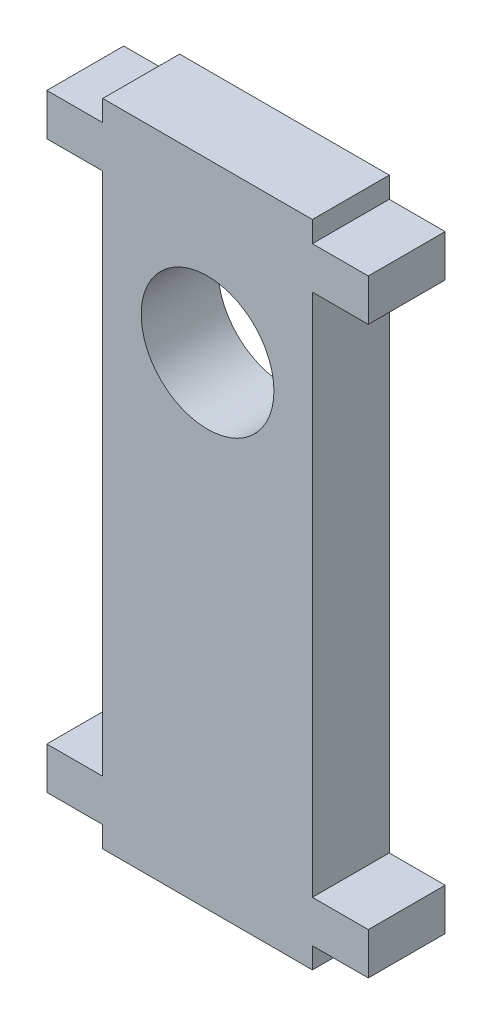
ISO-10303-21;
HEADER;
FILE_DESCRIPTION(('STEP AP214'),'2;1');
FILE_NAME('part.step','',(''),(''),'','','');
FILE_SCHEMA(('AUTOMOTIVE_DESIGN { 1 0 10303 214 1 1 1 1 }'));
ENDSEC;
DATA;
#1=APPLICATION_CONTEXT('core data for automotive mechanical design processes');
#2=APPLICATION_PROTOCOL_DEFINITION('international standard','automotive_design',2000,#1);
#3=PRODUCT_CONTEXT('',#1,'mechanical');
#4=PRODUCT('Part','Part','',(#3));
#5=PRODUCT_RELATED_PRODUCT_CATEGORY('part','',(#4));
#6=PRODUCT_DEFINITION_FORMATION('','',#4);
#7=PRODUCT_DEFINITION_CONTEXT('part definition',#1,'design');
#8=PRODUCT_DEFINITION('design','',#6,#7);
#9=PRODUCT_DEFINITION_SHAPE('','',#8);
#10=(LENGTH_UNIT() NAMED_UNIT(*) SI_UNIT(.MILLI.,.METRE.));
#11=(NAMED_UNIT(*) PLANE_ANGLE_UNIT() SI_UNIT($,.RADIAN.));
#12=(NAMED_UNIT(*) SI_UNIT($,.STERADIAN.) SOLID_ANGLE_UNIT());
#13=UNCERTAINTY_MEASURE_WITH_UNIT(LENGTH_MEASURE(1.E-05),#10,'distance_accuracy_value','');
#14=(GEOMETRIC_REPRESENTATION_CONTEXT(3) GLOBAL_UNCERTAINTY_ASSIGNED_CONTEXT((#13)) GLOBAL_UNIT_ASSIGNED_CONTEXT((#10,
#11,#12)) REPRESENTATION_CONTEXT('',''));
#15=CARTESIAN_POINT('',(0.,0.,0.));
#16=DIRECTION('',(0.,0.,1.));
#17=DIRECTION('',(1.,0.,0.));
#18=AXIS2_PLACEMENT_3D('',#15,#16,#17);
#19=CARTESIAN_POINT('',(0.,0.,11.));
#20=DIRECTION('',(0.,0.,1.));
#21=DIRECTION('',(1.,0.,0.));
#22=AXIS2_PLACEMENT_3D('',#19,#20,#21);
#23=PLANE('',#22);
#24=DIRECTION('',(0.,-1.,0.));
#25=VECTOR('',#24,1.);
#26=CARTESIAN_POINT('',(0.,0.,11.));
#27=LINE('',#26,#25);
#28=CARTESIAN_POINT('',(0.,0.,11.));
#29=VERTEX_POINT('',#28);
#30=CARTESIAN_POINT('',(0.,-3.,11.));
#31=VERTEX_POINT('',#30);
#32=EDGE_CURVE('E251',#29,#31,#27,.T.);
#33=ORIENTED_EDGE('',*,*,#32,.T.);
#34=DIRECTION('',(1.,0.,0.));
#35=VECTOR('',#34,1.);
#36=CARTESIAN_POINT('',(0.,-3.,11.));
#37=LINE('',#36,#35);
#38=CARTESIAN_POINT('',(30.,-3.,11.));
#39=VERTEX_POINT('',#38);
#40=EDGE_CURVE('E138',#31,#39,#37,.T.);
#41=ORIENTED_EDGE('',*,*,#40,.T.);
#42=DIRECTION('',(0.,1.,0.));
#43=VECTOR('',#42,1.);
#44=CARTESIAN_POINT('',(30.,-3.,11.));
#45=LINE('',#44,#43);
#46=CARTESIAN_POINT('',(30.,0.,11.));
#47=VERTEX_POINT('',#46);
#48=EDGE_CURVE('E302',#39,#47,#45,.T.);
#49=ORIENTED_EDGE('',*,*,#48,.T.);
#50=DIRECTION('',(1.,0.,0.));
#51=VECTOR('',#50,1.);
#52=CARTESIAN_POINT('',(30.,0.,11.));
#53=LINE('',#52,#51);
#54=CARTESIAN_POINT('',(38.,0.,11.));
#55=VERTEX_POINT('',#54);
#56=EDGE_CURVE('E321',#47,#55,#53,.T.);
#57=ORIENTED_EDGE('',*,*,#56,.T.);
#58=DIRECTION('',(0.,1.,0.));
#59=VECTOR('',#58,1.);
#60=CARTESIAN_POINT('',(38.,0.,11.));
#61=LINE('',#60,#59);
#62=CARTESIAN_POINT('',(38.,6.,11.));
#63=VERTEX_POINT('',#62);
#64=EDGE_CURVE('E318',#55,#63,#61,.T.);
#65=ORIENTED_EDGE('',*,*,#64,.T.);
#66=DIRECTION('',(-1.,0.,0.));
#67=VECTOR('',#66,1.);
#68=CARTESIAN_POINT('',(38.,6.,11.));
#69=LINE('',#68,#67);
#70=CARTESIAN_POINT('',(30.,6.,11.));
#71=VERTEX_POINT('',#70);
#72=EDGE_CURVE('E320',#63,#71,#69,.T.);
#73=ORIENTED_EDGE('',*,*,#72,.T.);
#74=DIRECTION('',(0.,1.,0.));
#75=VECTOR('',#74,1.);
#76=CARTESIAN_POINT('',(30.,81.,11.));
#77=LINE('',#76,#75);
#78=CARTESIAN_POINT('',(30.,81.,11.));
#79=VERTEX_POINT('',#78);
#80=EDGE_CURVE('E323',#71,#79,#77,.T.);
#81=ORIENTED_EDGE('',*,*,#80,.T.);
#82=DIRECTION('',(1.,0.,0.));
#83=VECTOR('',#82,1.);
#84=CARTESIAN_POINT('',(30.,81.,11.));
#85=LINE('',#84,#83);
#86=CARTESIAN_POINT('',(38.,81.,11.));
#87=VERTEX_POINT('',#86);
#88=EDGE_CURVE('E329',#79,#87,#85,.T.);
#89=ORIENTED_EDGE('',*,*,#88,.T.);
#90=DIRECTION('',(0.,1.,0.));
#91=VECTOR('',#90,1.);
#92=CARTESIAN_POINT('',(38.,81.,11.));
#93=LINE('',#92,#91);
#94=CARTESIAN_POINT('',(38.,87.,11.));
#95=VERTEX_POINT('',#94);
#96=EDGE_CURVE('E331',#87,#95,#93,.T.);
#97=ORIENTED_EDGE('',*,*,#96,.T.);
#98=DIRECTION('',(-1.,0.,0.));
#99=VECTOR('',#98,1.);
#100=CARTESIAN_POINT('',(38.,87.,11.));
#101=LINE('',#100,#99);
#102=CARTESIAN_POINT('',(30.,87.,11.));
#103=VERTEX_POINT('',#102);
#104=EDGE_CURVE('E333',#95,#103,#101,.T.);
#105=ORIENTED_EDGE('',*,*,#104,.T.);
#106=DIRECTION('',(0.,1.,0.));
#107=VECTOR('',#106,1.);
#108=CARTESIAN_POINT('',(30.,87.,11.));
#109=LINE('',#108,#107);
#110=CARTESIAN_POINT('',(30.,90.,11.));
#111=VERTEX_POINT('',#110);
#112=EDGE_CURVE('E335',#103,#111,#109,.T.);
#113=ORIENTED_EDGE('',*,*,#112,.T.);
#114=DIRECTION('',(-1.,0.,0.));
#115=VECTOR('',#114,1.);
#116=CARTESIAN_POINT('',(25.,90.,11.));
#117=LINE('',#116,#115);
#118=CARTESIAN_POINT('',(0.,90.,11.));
#119=VERTEX_POINT('',#118);
#120=EDGE_CURVE('E337',#111,#119,#117,.T.);
#121=ORIENTED_EDGE('',*,*,#120,.T.);
#122=DIRECTION('',(0.,-1.,0.));
#123=VECTOR('',#122,1.);
#124=CARTESIAN_POINT('',(0.,90.,11.));
#125=LINE('',#124,#123);
#126=CARTESIAN_POINT('',(0.,87.,11.));
#127=VERTEX_POINT('',#126);
#128=EDGE_CURVE('E339',#119,#127,#125,.T.);
#129=ORIENTED_EDGE('',*,*,#128,.T.);
#130=DIRECTION('',(-1.,0.,0.));
#131=VECTOR('',#130,1.);
#132=CARTESIAN_POINT('',(0.,87.,11.));
#133=LINE('',#132,#131);
#134=CARTESIAN_POINT('',(-8.00000000000001,87.,11.));
#135=VERTEX_POINT('',#134);
#136=EDGE_CURVE('E341',#127,#135,#133,.T.);
#137=ORIENTED_EDGE('',*,*,#136,.T.);
#138=DIRECTION('',(0.,-1.,0.));
#139=VECTOR('',#138,1.);
#140=CARTESIAN_POINT('',(-8.00000000000001,87.,11.));
#141=LINE('',#140,#139);
#142=CARTESIAN_POINT('',(-8.00000000000001,81.,11.));
#143=VERTEX_POINT('',#142);
#144=EDGE_CURVE('E343',#135,#143,#141,.T.);
#145=ORIENTED_EDGE('',*,*,#144,.T.);
#146=DIRECTION('',(1.,0.,0.));
#147=VECTOR('',#146,1.);
#148=CARTESIAN_POINT('',(-8.00000000000001,81.,11.));
#149=LINE('',#148,#147);
#150=CARTESIAN_POINT('',(0.,81.,11.));
#151=VERTEX_POINT('',#150);
#152=EDGE_CURVE('E345',#143,#151,#149,.T.);
#153=ORIENTED_EDGE('',*,*,#152,.T.);
#154=DIRECTION('',(0.,-1.,0.));
#155=VECTOR('',#154,1.);
#156=CARTESIAN_POINT('',(0.,81.,11.));
#157=LINE('',#156,#155);
#158=CARTESIAN_POINT('',(0.,6.,11.));
#159=VERTEX_POINT('',#158);
#160=EDGE_CURVE('E193',#151,#159,#157,.T.);
#161=ORIENTED_EDGE('',*,*,#160,.T.);
#162=DIRECTION('',(-1.,0.,0.));
#163=VECTOR('',#162,1.);
#164=CARTESIAN_POINT('',(0.,6.,11.));
#165=LINE('',#164,#163);
#166=CARTESIAN_POINT('',(-8.,6.,11.));
#167=VERTEX_POINT('',#166);
#168=EDGE_CURVE('E187',#159,#167,#165,.T.);
#169=ORIENTED_EDGE('',*,*,#168,.T.);
#170=DIRECTION('',(0.,-1.,0.));
#171=VECTOR('',#170,1.);
#172=CARTESIAN_POINT('',(-8.,6.,11.));
#173=LINE('',#172,#171);
#174=CARTESIAN_POINT('',(-8.,0.,11.));
#175=VERTEX_POINT('',#174);
#176=EDGE_CURVE('E191',#167,#175,#173,.T.);
#177=ORIENTED_EDGE('',*,*,#176,.T.);
#178=DIRECTION('',(1.,0.,0.));
#179=VECTOR('',#178,1.);
#180=CARTESIAN_POINT('',(-8.,0.,11.));
#181=LINE('',#180,#179);
#182=EDGE_CURVE('E59',#175,#29,#181,.T.);
#183=ORIENTED_EDGE('',*,*,#182,.T.);
#184=EDGE_LOOP('',(#33,#41,#49,#57,#65,#73,#81,#89,#97,#105,#113,#121,#129,#137,#145,#153,#161,
#169,#177,#183));
#185=FACE_BOUND('',#184,.T.);
#186=CARTESIAN_POINT('',(15.,66.,11.));
#187=DIRECTION('',(0.,0.,1.));
#188=DIRECTION('',(1.,0.,0.));
#189=AXIS2_PLACEMENT_3D('',#186,#187,#188);
#190=CIRCLE('',#189,9.5);
#191=CARTESIAN_POINT('',(24.5,66.,11.));
#192=VERTEX_POINT('',#191);
#193=EDGE_CURVE('E215',#192,#192,#190,.T.);
#194=ORIENTED_EDGE('',*,*,#193,.F.);
#195=EDGE_LOOP('',(#194));
#196=FACE_BOUND('',#195,.T.);
#197=ADVANCED_FACE('F42',(#185,#196),#23,.T.);
#198=CARTESIAN_POINT('',(0.,0.,0.));
#199=DIRECTION('',(0.,0.,1.));
#200=DIRECTION('',(1.,0.,0.));
#201=AXIS2_PLACEMENT_3D('',#198,#199,#200);
#202=PLANE('',#201);
#203=DIRECTION('',(0.,-1.,0.));
#204=VECTOR('',#203,1.);
#205=CARTESIAN_POINT('',(0.,0.,0.));
#206=LINE('',#205,#204);
#207=CARTESIAN_POINT('',(0.,0.,0.));
#208=VERTEX_POINT('',#207);
#209=CARTESIAN_POINT('',(0.,-3.,0.));
#210=VERTEX_POINT('',#209);
#211=EDGE_CURVE('E211',#208,#210,#206,.T.);
#212=ORIENTED_EDGE('',*,*,#211,.F.);
#213=DIRECTION('',(1.,0.,0.));
#214=VECTOR('',#213,1.);
#215=CARTESIAN_POINT('',(-8.,0.,0.));
#216=LINE('',#215,#214);
#217=CARTESIAN_POINT('',(-8.,0.,0.));
#218=VERTEX_POINT('',#217);
#219=EDGE_CURVE('E130',#218,#208,#216,.T.);
#220=ORIENTED_EDGE('',*,*,#219,.F.);
#221=DIRECTION('',(0.,-1.,0.));
#222=VECTOR('',#221,1.);
#223=CARTESIAN_POINT('',(-8.,6.,0.));
#224=LINE('',#223,#222);
#225=CARTESIAN_POINT('',(-8.,6.,0.));
#226=VERTEX_POINT('',#225);
#227=EDGE_CURVE('E124',#226,#218,#224,.T.);
#228=ORIENTED_EDGE('',*,*,#227,.F.);
#229=DIRECTION('',(-1.,0.,0.));
#230=VECTOR('',#229,1.);
#231=CARTESIAN_POINT('',(0.,6.,0.));
#232=LINE('',#231,#230);
#233=CARTESIAN_POINT('',(0.,6.,0.));
#234=VERTEX_POINT('',#233);
#235=EDGE_CURVE('E201',#234,#226,#232,.T.);
#236=ORIENTED_EDGE('',*,*,#235,.F.);
#237=DIRECTION('',(0.,-1.,0.));
#238=VECTOR('',#237,1.);
#239=CARTESIAN_POINT('',(0.,81.,0.));
#240=LINE('',#239,#238);
#241=CARTESIAN_POINT('',(0.,81.,0.));
#242=VERTEX_POINT('',#241);
#243=EDGE_CURVE('E246',#242,#234,#240,.T.);
#244=ORIENTED_EDGE('',*,*,#243,.F.);
#245=DIRECTION('',(1.,0.,0.));
#246=VECTOR('',#245,1.);
#247=CARTESIAN_POINT('',(-8.00000000000001,81.,0.));
#248=LINE('',#247,#246);
#249=CARTESIAN_POINT('',(-8.00000000000001,81.,0.));
#250=VERTEX_POINT('',#249);
#251=EDGE_CURVE('E244',#250,#242,#248,.T.);
#252=ORIENTED_EDGE('',*,*,#251,.F.);
#253=DIRECTION('',(0.,-1.,0.));
#254=VECTOR('',#253,1.);
#255=CARTESIAN_POINT('',(-8.00000000000001,87.,0.));
#256=LINE('',#255,#254);
#257=CARTESIAN_POINT('',(-8.00000000000001,87.,0.));
#258=VERTEX_POINT('',#257);
#259=EDGE_CURVE('E242',#258,#250,#256,.T.);
#260=ORIENTED_EDGE('',*,*,#259,.F.);
#261=DIRECTION('',(-1.,0.,0.));
#262=VECTOR('',#261,1.);
#263=CARTESIAN_POINT('',(0.,87.,0.));
#264=LINE('',#263,#262);
#265=CARTESIAN_POINT('',(0.,87.,0.));
#266=VERTEX_POINT('',#265);
#267=EDGE_CURVE('E240',#266,#258,#264,.T.);
#268=ORIENTED_EDGE('',*,*,#267,.F.);
#269=DIRECTION('',(0.,-1.,0.));
#270=VECTOR('',#269,1.);
#271=CARTESIAN_POINT('',(0.,90.,0.));
#272=LINE('',#271,#270);
#273=CARTESIAN_POINT('',(0.,90.,0.));
#274=VERTEX_POINT('',#273);
#275=EDGE_CURVE('E238',#274,#266,#272,.T.);
#276=ORIENTED_EDGE('',*,*,#275,.F.);
#277=DIRECTION('',(-1.,0.,0.));
#278=VECTOR('',#277,1.);
#279=CARTESIAN_POINT('',(0.,90.,0.));
#280=LINE('',#279,#278);
#281=CARTESIAN_POINT('',(30.,90.,0.));
#282=VERTEX_POINT('',#281);
#283=EDGE_CURVE('E236',#282,#274,#280,.T.);
#284=ORIENTED_EDGE('',*,*,#283,.F.);
#285=DIRECTION('',(0.,1.,0.));
#286=VECTOR('',#285,1.);
#287=CARTESIAN_POINT('',(30.,87.,0.));
#288=LINE('',#287,#286);
#289=CARTESIAN_POINT('',(30.,87.,0.));
#290=VERTEX_POINT('',#289);
#291=EDGE_CURVE('E233',#290,#282,#288,.T.);
#292=ORIENTED_EDGE('',*,*,#291,.F.);
#293=DIRECTION('',(-1.,0.,0.));
#294=VECTOR('',#293,1.);
#295=CARTESIAN_POINT('',(38.,87.,0.));
#296=LINE('',#295,#294);
#297=CARTESIAN_POINT('',(38.,87.,0.));
#298=VERTEX_POINT('',#297);
#299=EDGE_CURVE('E231',#298,#290,#296,.T.);
#300=ORIENTED_EDGE('',*,*,#299,.F.);
#301=DIRECTION('',(0.,1.,0.));
#302=VECTOR('',#301,1.);
#303=CARTESIAN_POINT('',(38.,81.,0.));
#304=LINE('',#303,#302);
#305=CARTESIAN_POINT('',(38.,81.,0.));
#306=VERTEX_POINT('',#305);
#307=EDGE_CURVE('E229',#306,#298,#304,.T.);
#308=ORIENTED_EDGE('',*,*,#307,.F.);
#309=DIRECTION('',(1.,0.,0.));
#310=VECTOR('',#309,1.);
#311=CARTESIAN_POINT('',(30.,81.,0.));
#312=LINE('',#311,#310);
#313=CARTESIAN_POINT('',(30.,81.,0.));
#314=VERTEX_POINT('',#313);
#315=EDGE_CURVE('E227',#314,#306,#312,.T.);
#316=ORIENTED_EDGE('',*,*,#315,.F.);
#317=DIRECTION('',(0.,1.,0.));
#318=VECTOR('',#317,1.);
#319=CARTESIAN_POINT('',(30.,81.,0.));
#320=LINE('',#319,#318);
#321=CARTESIAN_POINT('',(30.,6.,0.));
#322=VERTEX_POINT('',#321);
#323=EDGE_CURVE('E225',#322,#314,#320,.T.);
#324=ORIENTED_EDGE('',*,*,#323,.F.);
#325=DIRECTION('',(-1.,0.,0.));
#326=VECTOR('',#325,1.);
#327=CARTESIAN_POINT('',(38.,6.,0.));
#328=LINE('',#327,#326);
#329=CARTESIAN_POINT('',(38.,6.,0.));
#330=VERTEX_POINT('',#329);
#331=EDGE_CURVE('E223',#330,#322,#328,.T.);
#332=ORIENTED_EDGE('',*,*,#331,.F.);
#333=DIRECTION('',(0.,1.,0.));
#334=VECTOR('',#333,1.);
#335=CARTESIAN_POINT('',(38.,0.,0.));
#336=LINE('',#335,#334);
#337=CARTESIAN_POINT('',(38.,0.,0.));
#338=VERTEX_POINT('',#337);
#339=EDGE_CURVE('E221',#338,#330,#336,.T.);
#340=ORIENTED_EDGE('',*,*,#339,.F.);
#341=DIRECTION('',(1.,0.,0.));
#342=VECTOR('',#341,1.);
#343=CARTESIAN_POINT('',(30.,0.,0.));
#344=LINE('',#343,#342);
#345=CARTESIAN_POINT('',(30.,0.,0.));
#346=VERTEX_POINT('',#345);
#347=EDGE_CURVE('E219',#346,#338,#344,.T.);
#348=ORIENTED_EDGE('',*,*,#347,.F.);
#349=DIRECTION('',(0.,1.,0.));
#350=VECTOR('',#349,1.);
#351=CARTESIAN_POINT('',(30.,-3.,0.));
#352=LINE('',#351,#350);
#353=CARTESIAN_POINT('',(30.,-3.,0.));
#354=VERTEX_POINT('',#353);
#355=EDGE_CURVE('E217',#354,#346,#352,.T.);
#356=ORIENTED_EDGE('',*,*,#355,.F.);
#357=DIRECTION('',(1.,0.,0.));
#358=VECTOR('',#357,1.);
#359=CARTESIAN_POINT('',(0.,-3.,0.));
#360=LINE('',#359,#358);
#361=EDGE_CURVE('E214',#210,#354,#360,.T.);
#362=ORIENTED_EDGE('',*,*,#361,.F.);
#363=EDGE_LOOP('',(#212,#220,#228,#236,#244,#252,#260,#268,#276,#284,#292,#300,#308,#316,#324,
#332,#340,#348,#356,#362));
#364=FACE_BOUND('',#363,.T.);
#365=CARTESIAN_POINT('',(15.,66.,0.));
#366=DIRECTION('',(0.,0.,1.));
#367=DIRECTION('',(1.,0.,0.));
#368=AXIS2_PLACEMENT_3D('',#365,#366,#367);
#369=CIRCLE('',#368,9.5);
#370=CARTESIAN_POINT('',(24.5,66.,0.));
#371=VERTEX_POINT('',#370);
#372=EDGE_CURVE('E601',#371,#371,#369,.T.);
#373=ORIENTED_EDGE('',*,*,#372,.T.);
#374=EDGE_LOOP('',(#373));
#375=FACE_BOUND('',#374,.T.);
#376=ADVANCED_FACE('F306',(#364,#375),#202,.F.);
#377=CARTESIAN_POINT('',(0.,0.,11.));
#378=DIRECTION('',(1.,0.,0.));
#379=DIRECTION('',(0.,1.,0.));
#380=AXIS2_PLACEMENT_3D('',#377,#378,#379);
#381=PLANE('',#380);
#382=ORIENTED_EDGE('',*,*,#211,.T.);
#383=DIRECTION('',(0.,0.,-1.));
#384=VECTOR('',#383,1.);
#385=CARTESIAN_POINT('',(0.,-3.,11.));
#386=LINE('',#385,#384);
#387=EDGE_CURVE('E13',#31,#210,#386,.T.);
#388=ORIENTED_EDGE('',*,*,#387,.F.);
#389=ORIENTED_EDGE('',*,*,#32,.F.);
#390=DIRECTION('',(0.,0.,-1.));
#391=VECTOR('',#390,1.);
#392=CARTESIAN_POINT('',(0.,0.,11.));
#393=LINE('',#392,#391);
#394=EDGE_CURVE('E207',#29,#208,#393,.T.);
#395=ORIENTED_EDGE('',*,*,#394,.T.);
#396=EDGE_LOOP('',(#382,#388,#389,#395));
#397=FACE_BOUND('',#396,.T.);
#398=ADVANCED_FACE('F44',(#397),#381,.F.);
#399=CARTESIAN_POINT('',(0.,-3.,11.));
#400=DIRECTION('',(0.,1.,0.));
#401=DIRECTION('',(-1.,0.,0.));
#402=AXIS2_PLACEMENT_3D('',#399,#400,#401);
#403=PLANE('',#402);
#404=ORIENTED_EDGE('',*,*,#361,.T.);
#405=DIRECTION('',(0.,0.,-1.));
#406=VECTOR('',#405,1.);
#407=CARTESIAN_POINT('',(30.,-3.,11.));
#408=LINE('',#407,#406);
#409=EDGE_CURVE('E51',#39,#354,#408,.T.);
#410=ORIENTED_EDGE('',*,*,#409,.F.);
#411=ORIENTED_EDGE('',*,*,#40,.F.);
#412=ORIENTED_EDGE('',*,*,#387,.T.);
#413=EDGE_LOOP('',(#404,#410,#411,#412));
#414=FACE_BOUND('',#413,.T.);
#415=ADVANCED_FACE('F379',(#414),#403,.F.);
#416=CARTESIAN_POINT('',(30.,-3.,11.));
#417=DIRECTION('',(-1.,0.,0.));
#418=DIRECTION('',(0.,-1.,0.));
#419=AXIS2_PLACEMENT_3D('',#416,#417,#418);
#420=PLANE('',#419);
#421=ORIENTED_EDGE('',*,*,#355,.T.);
#422=DIRECTION('',(0.,0.,-1.));
#423=VECTOR('',#422,1.);
#424=CARTESIAN_POINT('',(30.,0.,11.));
#425=LINE('',#424,#423);
#426=EDGE_CURVE('E294',#47,#346,#425,.T.);
#427=ORIENTED_EDGE('',*,*,#426,.F.);
#428=ORIENTED_EDGE('',*,*,#48,.F.);
#429=ORIENTED_EDGE('',*,*,#409,.T.);
#430=EDGE_LOOP('',(#421,#427,#428,#429));
#431=FACE_BOUND('',#430,.T.);
#432=ADVANCED_FACE('F300',(#431),#420,.F.);
#433=CARTESIAN_POINT('',(30.,0.,11.));
#434=DIRECTION('',(0.,1.,0.));
#435=DIRECTION('',(-1.,0.,0.));
#436=AXIS2_PLACEMENT_3D('',#433,#434,#435);
#437=PLANE('',#436);
#438=ORIENTED_EDGE('',*,*,#347,.T.);
#439=DIRECTION('',(0.,0.,-1.));
#440=VECTOR('',#439,1.);
#441=CARTESIAN_POINT('',(38.,0.,11.));
#442=LINE('',#441,#440);
#443=EDGE_CURVE('E291',#55,#338,#442,.T.);
#444=ORIENTED_EDGE('',*,*,#443,.F.);
#445=ORIENTED_EDGE('',*,*,#56,.F.);
#446=ORIENTED_EDGE('',*,*,#426,.T.);
#447=EDGE_LOOP('',(#438,#444,#445,#446));
#448=FACE_BOUND('',#447,.T.);
#449=ADVANCED_FACE('F312',(#448),#437,.F.);
#450=CARTESIAN_POINT('',(38.,0.,11.));
#451=DIRECTION('',(-1.,0.,0.));
#452=DIRECTION('',(0.,0.,1.));
#453=AXIS2_PLACEMENT_3D('',#450,#451,#452);
#454=PLANE('',#453);
#455=ORIENTED_EDGE('',*,*,#339,.T.);
#456=DIRECTION('',(0.,0.,-1.));
#457=VECTOR('',#456,1.);
#458=CARTESIAN_POINT('',(38.,6.,11.));
#459=LINE('',#458,#457);
#460=EDGE_CURVE('E288',#63,#330,#459,.T.);
#461=ORIENTED_EDGE('',*,*,#460,.F.);
#462=ORIENTED_EDGE('',*,*,#64,.F.);
#463=ORIENTED_EDGE('',*,*,#443,.T.);
#464=EDGE_LOOP('',(#455,#461,#462,#463));
#465=FACE_BOUND('',#464,.T.);
#466=ADVANCED_FACE('F316',(#465),#454,.F.);
#467=CARTESIAN_POINT('',(38.,6.,11.));
#468=DIRECTION('',(0.,-1.,0.));
#469=DIRECTION('',(1.,0.,0.));
#470=AXIS2_PLACEMENT_3D('',#467,#468,#469);
#471=PLANE('',#470);
#472=ORIENTED_EDGE('',*,*,#331,.T.);
#473=DIRECTION('',(0.,0.,-1.));
#474=VECTOR('',#473,1.);
#475=CARTESIAN_POINT('',(30.,6.,11.));
#476=LINE('',#475,#474);
#477=EDGE_CURVE('E285',#71,#322,#476,.T.);
#478=ORIENTED_EDGE('',*,*,#477,.F.);
#479=ORIENTED_EDGE('',*,*,#72,.F.);
#480=ORIENTED_EDGE('',*,*,#460,.T.);
#481=EDGE_LOOP('',(#472,#478,#479,#480));
#482=FACE_BOUND('',#481,.T.);
#483=ADVANCED_FACE('F392',(#482),#471,.F.);
#484=CARTESIAN_POINT('',(30.,81.,11.));
#485=DIRECTION('',(-1.,0.,0.));
#486=DIRECTION('',(0.,-1.,0.));
#487=AXIS2_PLACEMENT_3D('',#484,#485,#486);
#488=PLANE('',#487);
#489=ORIENTED_EDGE('',*,*,#323,.T.);
#490=DIRECTION('',(0.,0.,-1.));
#491=VECTOR('',#490,1.);
#492=CARTESIAN_POINT('',(30.,81.,11.));
#493=LINE('',#492,#491);
#494=EDGE_CURVE('E282',#79,#314,#493,.T.);
#495=ORIENTED_EDGE('',*,*,#494,.F.);
#496=ORIENTED_EDGE('',*,*,#80,.F.);
#497=ORIENTED_EDGE('',*,*,#477,.T.);
#498=EDGE_LOOP('',(#489,#495,#496,#497));
#499=FACE_BOUND('',#498,.T.);
#500=ADVANCED_FACE('F395',(#499),#488,.F.);
#501=CARTESIAN_POINT('',(30.,81.,11.));
#502=DIRECTION('',(0.,1.,0.));
#503=DIRECTION('',(0.,0.,1.));
#504=AXIS2_PLACEMENT_3D('',#501,#502,#503);
#505=PLANE('',#504);
#506=ORIENTED_EDGE('',*,*,#315,.T.);
#507=DIRECTION('',(0.,0.,-1.));
#508=VECTOR('',#507,1.);
#509=CARTESIAN_POINT('',(38.,81.,11.));
#510=LINE('',#509,#508);
#511=EDGE_CURVE('E279',#87,#306,#510,.T.);
#512=ORIENTED_EDGE('',*,*,#511,.F.);
#513=ORIENTED_EDGE('',*,*,#88,.F.);
#514=ORIENTED_EDGE('',*,*,#494,.T.);
#515=EDGE_LOOP('',(#506,#512,#513,#514));
#516=FACE_BOUND('',#515,.T.);
#517=ADVANCED_FACE('F399',(#516),#505,.F.);
#518=CARTESIAN_POINT('',(38.,81.,11.));
#519=DIRECTION('',(-1.,0.,0.));
#520=DIRECTION('',(0.,-1.,0.));
#521=AXIS2_PLACEMENT_3D('',#518,#519,#520);
#522=PLANE('',#521);
#523=ORIENTED_EDGE('',*,*,#307,.T.);
#524=DIRECTION('',(0.,0.,-1.));
#525=VECTOR('',#524,1.);
#526=CARTESIAN_POINT('',(38.,87.,11.));
#527=LINE('',#526,#525);
#528=EDGE_CURVE('E276',#95,#298,#527,.T.);
#529=ORIENTED_EDGE('',*,*,#528,.F.);
#530=ORIENTED_EDGE('',*,*,#96,.F.);
#531=ORIENTED_EDGE('',*,*,#511,.T.);
#532=EDGE_LOOP('',(#523,#529,#530,#531));
#533=FACE_BOUND('',#532,.T.);
#534=ADVANCED_FACE('F403',(#533),#522,.F.);
#535=CARTESIAN_POINT('',(38.,87.,11.));
#536=DIRECTION('',(0.,-1.,0.));
#537=DIRECTION('',(0.,0.,-1.));
#538=AXIS2_PLACEMENT_3D('',#535,#536,#537);
#539=PLANE('',#538);
#540=ORIENTED_EDGE('',*,*,#299,.T.);
#541=DIRECTION('',(0.,0.,-1.));
#542=VECTOR('',#541,1.);
#543=CARTESIAN_POINT('',(30.,87.,11.));
#544=LINE('',#543,#542);
#545=EDGE_CURVE('E273',#103,#290,#544,.T.);
#546=ORIENTED_EDGE('',*,*,#545,.F.);
#547=ORIENTED_EDGE('',*,*,#104,.F.);
#548=ORIENTED_EDGE('',*,*,#528,.T.);
#549=EDGE_LOOP('',(#540,#546,#547,#548));
#550=FACE_BOUND('',#549,.T.);
#551=ADVANCED_FACE('F407',(#550),#539,.F.);
#552=CARTESIAN_POINT('',(30.,87.,11.));
#553=DIRECTION('',(-1.,0.,0.));
#554=DIRECTION('',(0.,0.,1.));
#555=AXIS2_PLACEMENT_3D('',#552,#553,#554);
#556=PLANE('',#555);
#557=ORIENTED_EDGE('',*,*,#291,.T.);
#558=DIRECTION('',(0.,0.,-1.));
#559=VECTOR('',#558,1.);
#560=CARTESIAN_POINT('',(30.,90.,11.));
#561=LINE('',#560,#559);
#562=EDGE_CURVE('E270',#111,#282,#561,.T.);
#563=ORIENTED_EDGE('',*,*,#562,.F.);
#564=ORIENTED_EDGE('',*,*,#112,.F.);
#565=ORIENTED_EDGE('',*,*,#545,.T.);
#566=EDGE_LOOP('',(#557,#563,#564,#565));
#567=FACE_BOUND('',#566,.T.);
#568=ADVANCED_FACE('F411',(#567),#556,.F.);
#569=CARTESIAN_POINT('',(0.,90.,11.));
#570=DIRECTION('',(0.,-1.,0.));
#571=DIRECTION('',(0.,0.,-1.));
#572=AXIS2_PLACEMENT_3D('',#569,#570,#571);
#573=PLANE('',#572);
#574=ORIENTED_EDGE('',*,*,#283,.T.);
#575=DIRECTION('',(0.,0.,-1.));
#576=VECTOR('',#575,1.);
#577=CARTESIAN_POINT('',(0.,90.,11.));
#578=LINE('',#577,#576);
#579=EDGE_CURVE('E267',#119,#274,#578,.T.);
#580=ORIENTED_EDGE('',*,*,#579,.F.);
#581=ORIENTED_EDGE('',*,*,#120,.F.);
#582=ORIENTED_EDGE('',*,*,#562,.T.);
#583=EDGE_LOOP('',(#574,#580,#581,#582));
#584=FACE_BOUND('',#583,.T.);
#585=ADVANCED_FACE('F415',(#584),#573,.F.);
#586=CARTESIAN_POINT('',(0.,90.,11.));
#587=DIRECTION('',(1.,0.,0.));
#588=DIRECTION('',(0.,1.,0.));
#589=AXIS2_PLACEMENT_3D('',#586,#587,#588);
#590=PLANE('',#589);
#591=ORIENTED_EDGE('',*,*,#275,.T.);
#592=DIRECTION('',(0.,0.,-1.));
#593=VECTOR('',#592,1.);
#594=CARTESIAN_POINT('',(0.,87.,11.));
#595=LINE('',#594,#593);
#596=EDGE_CURVE('E264',#127,#266,#595,.T.);
#597=ORIENTED_EDGE('',*,*,#596,.F.);
#598=ORIENTED_EDGE('',*,*,#128,.F.);
#599=ORIENTED_EDGE('',*,*,#579,.T.);
#600=EDGE_LOOP('',(#591,#597,#598,#599));
#601=FACE_BOUND('',#600,.T.);
#602=ADVANCED_FACE('F419',(#601),#590,.F.);
#603=CARTESIAN_POINT('',(0.,87.,11.));
#604=DIRECTION('',(0.,-1.,0.));
#605=DIRECTION('',(0.,0.,-1.));
#606=AXIS2_PLACEMENT_3D('',#603,#604,#605);
#607=PLANE('',#606);
#608=ORIENTED_EDGE('',*,*,#267,.T.);
#609=DIRECTION('',(0.,0.,-1.));
#610=VECTOR('',#609,1.);
#611=CARTESIAN_POINT('',(-8.00000000000001,87.,11.));
#612=LINE('',#611,#610);
#613=EDGE_CURVE('E261',#135,#258,#612,.T.);
#614=ORIENTED_EDGE('',*,*,#613,.F.);
#615=ORIENTED_EDGE('',*,*,#136,.F.);
#616=ORIENTED_EDGE('',*,*,#596,.T.);
#617=EDGE_LOOP('',(#608,#614,#615,#616));
#618=FACE_BOUND('',#617,.T.);
#619=ADVANCED_FACE('F423',(#618),#607,.F.);
#620=CARTESIAN_POINT('',(-8.00000000000001,87.,11.));
#621=DIRECTION('',(1.,0.,0.));
#622=DIRECTION('',(0.,1.,0.));
#623=AXIS2_PLACEMENT_3D('',#620,#621,#622);
#624=PLANE('',#623);
#625=ORIENTED_EDGE('',*,*,#259,.T.);
#626=DIRECTION('',(0.,0.,-1.));
#627=VECTOR('',#626,1.);
#628=CARTESIAN_POINT('',(-8.00000000000001,81.,11.));
#629=LINE('',#628,#627);
#630=EDGE_CURVE('E258',#143,#250,#629,.T.);
#631=ORIENTED_EDGE('',*,*,#630,.F.);
#632=ORIENTED_EDGE('',*,*,#144,.F.);
#633=ORIENTED_EDGE('',*,*,#613,.T.);
#634=EDGE_LOOP('',(#625,#631,#632,#633));
#635=FACE_BOUND('',#634,.T.);
#636=ADVANCED_FACE('F427',(#635),#624,.F.);
#637=CARTESIAN_POINT('',(-8.00000000000001,81.,11.));
#638=DIRECTION('',(0.,1.,0.));
#639=DIRECTION('',(0.,0.,1.));
#640=AXIS2_PLACEMENT_3D('',#637,#638,#639);
#641=PLANE('',#640);
#642=ORIENTED_EDGE('',*,*,#251,.T.);
#643=DIRECTION('',(0.,0.,-1.));
#644=VECTOR('',#643,1.);
#645=CARTESIAN_POINT('',(0.,81.,11.));
#646=LINE('',#645,#644);
#647=EDGE_CURVE('E255',#151,#242,#646,.T.);
#648=ORIENTED_EDGE('',*,*,#647,.F.);
#649=ORIENTED_EDGE('',*,*,#152,.F.);
#650=ORIENTED_EDGE('',*,*,#630,.T.);
#651=EDGE_LOOP('',(#642,#648,#649,#650));
#652=FACE_BOUND('',#651,.T.);
#653=ADVANCED_FACE('F351',(#652),#641,.F.);
#654=CARTESIAN_POINT('',(0.,81.,11.));
#655=DIRECTION('',(1.,0.,0.));
#656=DIRECTION('',(0.,1.,0.));
#657=AXIS2_PLACEMENT_3D('',#654,#655,#656);
#658=PLANE('',#657);
#659=ORIENTED_EDGE('',*,*,#243,.T.);
#660=DIRECTION('',(0.,0.,-1.));
#661=VECTOR('',#660,1.);
#662=CARTESIAN_POINT('',(0.,6.,11.));
#663=LINE('',#662,#661);
#664=EDGE_CURVE('E202',#159,#234,#663,.T.);
#665=ORIENTED_EDGE('',*,*,#664,.F.);
#666=ORIENTED_EDGE('',*,*,#160,.F.);
#667=ORIENTED_EDGE('',*,*,#647,.T.);
#668=EDGE_LOOP('',(#659,#665,#666,#667));
#669=FACE_BOUND('',#668,.T.);
#670=ADVANCED_FACE('F355',(#669),#658,.F.);
#671=CARTESIAN_POINT('',(0.,6.,11.));
#672=DIRECTION('',(0.,-1.,0.));
#673=DIRECTION('',(1.,0.,0.));
#674=AXIS2_PLACEMENT_3D('',#671,#672,#673);
#675=PLANE('',#674);
#676=ORIENTED_EDGE('',*,*,#235,.T.);
#677=DIRECTION('',(0.,0.,-1.));
#678=VECTOR('',#677,1.);
#679=CARTESIAN_POINT('',(-8.,6.,11.));
#680=LINE('',#679,#678);
#681=EDGE_CURVE('E198',#167,#226,#680,.T.);
#682=ORIENTED_EDGE('',*,*,#681,.F.);
#683=ORIENTED_EDGE('',*,*,#168,.F.);
#684=ORIENTED_EDGE('',*,*,#664,.T.);
#685=EDGE_LOOP('',(#676,#682,#683,#684));
#686=FACE_BOUND('',#685,.T.);
#687=ADVANCED_FACE('F199',(#686),#675,.F.);
#688=CARTESIAN_POINT('',(-8.,6.,11.));
#689=DIRECTION('',(1.,0.,0.));
#690=DIRECTION('',(0.,0.,-1.));
#691=AXIS2_PLACEMENT_3D('',#688,#689,#690);
#692=PLANE('',#691);
#693=ORIENTED_EDGE('',*,*,#227,.T.);
#694=DIRECTION('',(0.,0.,-1.));
#695=VECTOR('',#694,1.);
#696=CARTESIAN_POINT('',(-8.,0.,11.));
#697=LINE('',#696,#695);
#698=EDGE_CURVE('E203',#175,#218,#697,.T.);
#699=ORIENTED_EDGE('',*,*,#698,.F.);
#700=ORIENTED_EDGE('',*,*,#176,.F.);
#701=ORIENTED_EDGE('',*,*,#681,.T.);
#702=EDGE_LOOP('',(#693,#699,#700,#701));
#703=FACE_BOUND('',#702,.T.);
#704=ADVANCED_FACE('F205',(#703),#692,.F.);
#705=CARTESIAN_POINT('',(-8.,0.,11.));
#706=DIRECTION('',(0.,1.,0.));
#707=DIRECTION('',(0.,0.,1.));
#708=AXIS2_PLACEMENT_3D('',#705,#706,#707);
#709=PLANE('',#708);
#710=ORIENTED_EDGE('',*,*,#219,.T.);
#711=ORIENTED_EDGE('',*,*,#394,.F.);
#712=ORIENTED_EDGE('',*,*,#182,.F.);
#713=ORIENTED_EDGE('',*,*,#698,.T.);
#714=EDGE_LOOP('',(#710,#711,#712,#713));
#715=FACE_BOUND('',#714,.T.);
#716=ADVANCED_FACE('F359',(#715),#709,.F.);
#717=CARTESIAN_POINT('',(15.,66.,11.));
#718=DIRECTION('',(0.,0.,-1.));
#719=DIRECTION('',(-1.,0.,0.));
#720=AXIS2_PLACEMENT_3D('',#717,#718,#719);
#721=CYLINDRICAL_SURFACE('',#720,9.5);
#722=ORIENTED_EDGE('',*,*,#193,.T.);
#723=EDGE_LOOP('',(#722));
#724=FACE_BOUND('',#723,.T.);
#725=ORIENTED_EDGE('',*,*,#372,.F.);
#726=EDGE_LOOP('',(#725));
#727=FACE_BOUND('',#726,.T.);
#728=ADVANCED_FACE('F361',(#724,#727),#721,.F.);
#729=CLOSED_SHELL('',(#197,#376,#398,#415,#432,#449,#466,#483,#500,#517,#534,#551,#568,#585,
#602,#619,#636,#653,#670,#687,#704,#716,#728));
#730=MANIFOLD_SOLID_BREP('B2',#729);
#731=ADVANCED_BREP_SHAPE_REPRESENTATION('',(#18,#730),#14);
#732=SHAPE_DEFINITION_REPRESENTATION(#9,#731);
ENDSEC;
END-ISO-10303-21;
